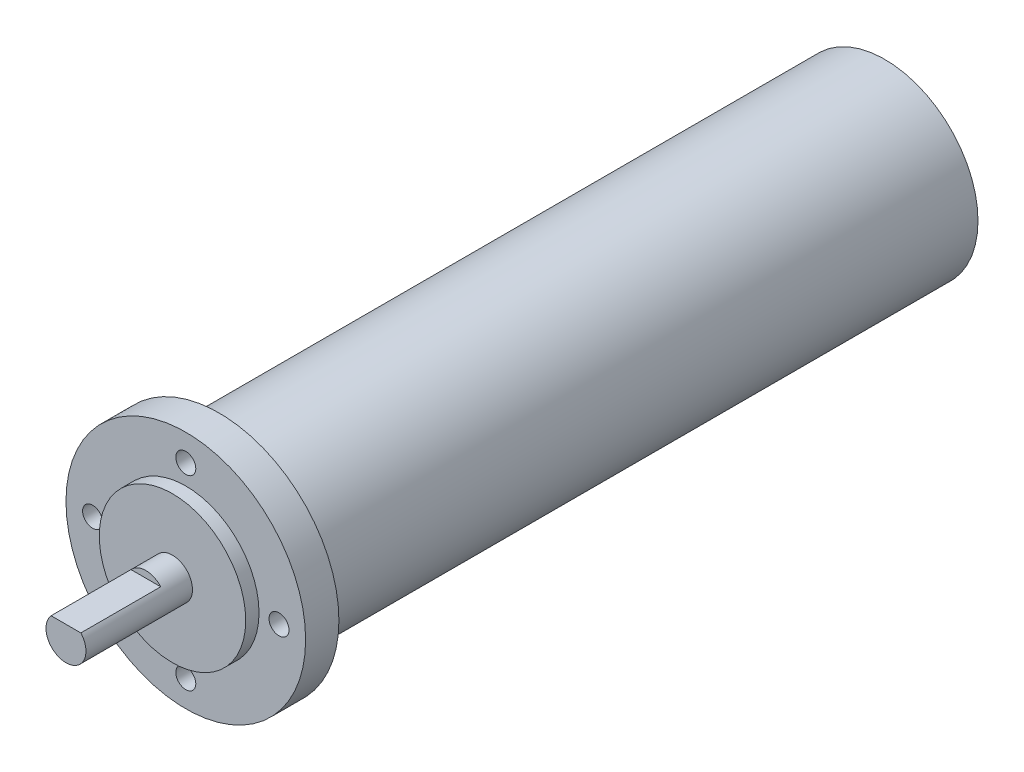
ISO-10303-21;
HEADER;
FILE_DESCRIPTION(('STEP AP214'),'2;1');
FILE_NAME('part.step','',(''),(''),'','','');
FILE_SCHEMA(('AUTOMOTIVE_DESIGN { 1 0 10303 214 1 1 1 1 }'));
ENDSEC;
DATA;
#1=APPLICATION_CONTEXT('core data for automotive mechanical design processes');
#2=APPLICATION_PROTOCOL_DEFINITION('international standard','automotive_design',2000,#1);
#3=PRODUCT_CONTEXT('',#1,'mechanical');
#4=PRODUCT('Part','Part','',(#3));
#5=PRODUCT_RELATED_PRODUCT_CATEGORY('part','',(#4));
#6=PRODUCT_DEFINITION_FORMATION('','',#4);
#7=PRODUCT_DEFINITION_CONTEXT('part definition',#1,'design');
#8=PRODUCT_DEFINITION('design','',#6,#7);
#9=PRODUCT_DEFINITION_SHAPE('','',#8);
#10=(LENGTH_UNIT() NAMED_UNIT(*) SI_UNIT(.MILLI.,.METRE.));
#11=(NAMED_UNIT(*) PLANE_ANGLE_UNIT() SI_UNIT($,.RADIAN.));
#12=(NAMED_UNIT(*) SI_UNIT($,.STERADIAN.) SOLID_ANGLE_UNIT());
#13=UNCERTAINTY_MEASURE_WITH_UNIT(LENGTH_MEASURE(1.E-05),#10,'distance_accuracy_value','');
#14=(GEOMETRIC_REPRESENTATION_CONTEXT(3) GLOBAL_UNCERTAINTY_ASSIGNED_CONTEXT((#13)) GLOBAL_UNIT_ASSIGNED_CONTEXT((#10,
#11,#12)) REPRESENTATION_CONTEXT('',''));
#15=CARTESIAN_POINT('',(0.,0.,0.));
#16=DIRECTION('',(0.,0.,1.));
#17=DIRECTION('',(1.,0.,0.));
#18=AXIS2_PLACEMENT_3D('',#15,#16,#17);
#19=CARTESIAN_POINT('',(0.,0.,107.));
#20=DIRECTION('',(0.,0.,1.));
#21=DIRECTION('',(1.,0.,0.));
#22=AXIS2_PLACEMENT_3D('',#19,#20,#21);
#23=PLANE('',#22);
#24=CARTESIAN_POINT('',(0.,0.,107.));
#25=DIRECTION('',(0.,0.,1.));
#26=DIRECTION('',(1.,0.,0.));
#27=AXIS2_PLACEMENT_3D('',#24,#25,#26);
#28=CIRCLE('',#27,11.);
#29=CARTESIAN_POINT('',(11.,0.,107.));
#30=VERTEX_POINT('',#29);
#31=EDGE_CURVE('E78',#30,#30,#28,.T.);
#32=ORIENTED_EDGE('',*,*,#31,.T.);
#33=EDGE_LOOP('',(#32));
#34=FACE_BOUND('',#33,.T.);
#35=CARTESIAN_POINT('',(0.,0.,107.));
#36=DIRECTION('',(0.,0.,1.));
#37=DIRECTION('',(1.,0.,0.));
#38=AXIS2_PLACEMENT_3D('',#35,#36,#37);
#39=CIRCLE('',#38,3.);
#40=CARTESIAN_POINT('',(3.,0.,107.));
#41=VERTEX_POINT('',#40);
#42=EDGE_CURVE('E70',#41,#41,#39,.T.);
#43=ORIENTED_EDGE('',*,*,#42,.F.);
#44=EDGE_LOOP('',(#43));
#45=FACE_BOUND('',#44,.T.);
#46=ADVANCED_FACE('F33',(#34,#45),#23,.T.);
#47=CARTESIAN_POINT('',(0.,0.,105.));
#48=DIRECTION('',(0.,0.,1.));
#49=DIRECTION('',(1.,0.,0.));
#50=AXIS2_PLACEMENT_3D('',#47,#48,#49);
#51=PLANE('',#50);
#52=CARTESIAN_POINT('',(0.,0.,105.));
#53=DIRECTION('',(0.,0.,1.));
#54=DIRECTION('',(1.,0.,0.));
#55=AXIS2_PLACEMENT_3D('',#52,#53,#54);
#56=CIRCLE('',#55,18.);
#57=CARTESIAN_POINT('',(18.,0.,105.));
#58=VERTEX_POINT('',#57);
#59=EDGE_CURVE('E108',#58,#58,#56,.T.);
#60=ORIENTED_EDGE('',*,*,#59,.T.);
#61=EDGE_LOOP('',(#60));
#62=FACE_BOUND('',#61,.T.);
#63=CARTESIAN_POINT('',(0.,14.,105.));
#64=DIRECTION('',(0.,0.,1.));
#65=DIRECTION('',(1.,0.,0.));
#66=AXIS2_PLACEMENT_3D('',#63,#64,#65);
#67=CIRCLE('',#66,1.5);
#68=CARTESIAN_POINT('',(1.5,14.,105.));
#69=VERTEX_POINT('',#68);
#70=EDGE_CURVE('E99',#69,#69,#67,.T.);
#71=ORIENTED_EDGE('',*,*,#70,.F.);
#72=EDGE_LOOP('',(#71));
#73=FACE_BOUND('',#72,.T.);
#74=CARTESIAN_POINT('',(14.,0.,105.));
#75=DIRECTION('',(0.,0.,1.));
#76=DIRECTION('',(1.,0.,0.));
#77=AXIS2_PLACEMENT_3D('',#74,#75,#76);
#78=CIRCLE('',#77,1.5);
#79=CARTESIAN_POINT('',(15.5,0.,105.));
#80=VERTEX_POINT('',#79);
#81=EDGE_CURVE('E93',#80,#80,#78,.T.);
#82=ORIENTED_EDGE('',*,*,#81,.F.);
#83=EDGE_LOOP('',(#82));
#84=FACE_BOUND('',#83,.T.);
#85=CARTESIAN_POINT('',(0.,-14.,105.));
#86=DIRECTION('',(0.,0.,1.));
#87=DIRECTION('',(1.,0.,0.));
#88=AXIS2_PLACEMENT_3D('',#85,#86,#87);
#89=CIRCLE('',#88,1.5);
#90=CARTESIAN_POINT('',(1.5,-14.,105.));
#91=VERTEX_POINT('',#90);
#92=EDGE_CURVE('E87',#91,#91,#89,.T.);
#93=ORIENTED_EDGE('',*,*,#92,.F.);
#94=EDGE_LOOP('',(#93));
#95=FACE_BOUND('',#94,.T.);
#96=CARTESIAN_POINT('',(-14.,0.,105.));
#97=DIRECTION('',(0.,0.,1.));
#98=DIRECTION('',(1.,0.,0.));
#99=AXIS2_PLACEMENT_3D('',#96,#97,#98);
#100=CIRCLE('',#99,1.5);
#101=CARTESIAN_POINT('',(-12.5,0.,105.));
#102=VERTEX_POINT('',#101);
#103=EDGE_CURVE('E81',#102,#102,#100,.T.);
#104=ORIENTED_EDGE('',*,*,#103,.F.);
#105=EDGE_LOOP('',(#104));
#106=FACE_BOUND('',#105,.T.);
#107=CARTESIAN_POINT('',(0.,0.,105.));
#108=DIRECTION('',(0.,0.,1.));
#109=DIRECTION('',(1.,0.,0.));
#110=AXIS2_PLACEMENT_3D('',#107,#108,#109);
#111=CIRCLE('',#110,11.);
#112=CARTESIAN_POINT('',(11.,0.,105.));
#113=VERTEX_POINT('',#112);
#114=EDGE_CURVE('E76',#113,#113,#111,.T.);
#115=ORIENTED_EDGE('',*,*,#114,.F.);
#116=EDGE_LOOP('',(#115));
#117=FACE_BOUND('',#116,.T.);
#118=ADVANCED_FACE('F131',(#62,#73,#84,#95,#106,#117),#51,.T.);
#119=CARTESIAN_POINT('',(0.,0.,100.));
#120=DIRECTION('',(0.,0.,-1.));
#121=DIRECTION('',(-1.,0.,0.));
#122=AXIS2_PLACEMENT_3D('',#119,#120,#121);
#123=CYLINDRICAL_SURFACE('',#122,14.);
#124=CARTESIAN_POINT('',(0.,0.,100.));
#125=DIRECTION('',(0.,0.,1.));
#126=DIRECTION('',(1.,0.,0.));
#127=AXIS2_PLACEMENT_3D('',#124,#125,#126);
#128=CIRCLE('',#127,14.);
#129=CARTESIAN_POINT('',(14.,0.,100.));
#130=VERTEX_POINT('',#129);
#131=EDGE_CURVE('E114',#130,#130,#128,.T.);
#132=ORIENTED_EDGE('',*,*,#131,.F.);
#133=EDGE_LOOP('',(#132));
#134=FACE_BOUND('',#133,.T.);
#135=CARTESIAN_POINT('',(0.,0.,0.));
#136=DIRECTION('',(0.,0.,1.));
#137=DIRECTION('',(1.,0.,0.));
#138=AXIS2_PLACEMENT_3D('',#135,#136,#137);
#139=CIRCLE('',#138,14.);
#140=CARTESIAN_POINT('',(14.,0.,0.));
#141=VERTEX_POINT('',#140);
#142=EDGE_CURVE('E111',#141,#141,#139,.T.);
#143=ORIENTED_EDGE('',*,*,#142,.T.);
#144=EDGE_LOOP('',(#143));
#145=FACE_BOUND('',#144,.T.);
#146=ADVANCED_FACE('F35',(#134,#145),#123,.T.);
#147=CARTESIAN_POINT('',(0.,0.,0.));
#148=DIRECTION('',(0.,0.,1.));
#149=DIRECTION('',(1.,0.,0.));
#150=AXIS2_PLACEMENT_3D('',#147,#148,#149);
#151=PLANE('',#150);
#152=ORIENTED_EDGE('',*,*,#142,.F.);
#153=EDGE_LOOP('',(#152));
#154=FACE_BOUND('',#153,.T.);
#155=ADVANCED_FACE('F121',(#154),#151,.F.);
#156=CARTESIAN_POINT('',(0.,0.,100.));
#157=DIRECTION('',(0.,0.,1.));
#158=DIRECTION('',(1.,0.,0.));
#159=AXIS2_PLACEMENT_3D('',#156,#157,#158);
#160=PLANE('',#159);
#161=CARTESIAN_POINT('',(0.,0.,100.));
#162=DIRECTION('',(0.,0.,1.));
#163=DIRECTION('',(1.,0.,0.));
#164=AXIS2_PLACEMENT_3D('',#161,#162,#163);
#165=CIRCLE('',#164,18.);
#166=CARTESIAN_POINT('',(18.,0.,100.));
#167=VERTEX_POINT('',#166);
#168=EDGE_CURVE('E105',#167,#167,#165,.T.);
#169=ORIENTED_EDGE('',*,*,#168,.F.);
#170=EDGE_LOOP('',(#169));
#171=FACE_BOUND('',#170,.T.);
#172=ORIENTED_EDGE('',*,*,#131,.T.);
#173=EDGE_LOOP('',(#172));
#174=FACE_BOUND('',#173,.T.);
#175=ADVANCED_FACE('F123',(#171,#174),#160,.F.);
#176=CARTESIAN_POINT('',(0.,0.,105.));
#177=DIRECTION('',(0.,0.,-1.));
#178=DIRECTION('',(-1.,0.,0.));
#179=AXIS2_PLACEMENT_3D('',#176,#177,#178);
#180=CYLINDRICAL_SURFACE('',#179,18.);
#181=ORIENTED_EDGE('',*,*,#59,.F.);
#182=EDGE_LOOP('',(#181));
#183=FACE_BOUND('',#182,.T.);
#184=ORIENTED_EDGE('',*,*,#168,.T.);
#185=EDGE_LOOP('',(#184));
#186=FACE_BOUND('',#185,.T.);
#187=ADVANCED_FACE('F128',(#183,#186),#180,.T.);
#188=CARTESIAN_POINT('',(0.,14.,101.));
#189=DIRECTION('',(0.,0.,1.));
#190=DIRECTION('',(1.,0.,0.));
#191=AXIS2_PLACEMENT_3D('',#188,#189,#190);
#192=CYLINDRICAL_SURFACE('',#191,1.5);
#193=CARTESIAN_POINT('',(0.,14.,101.));
#194=DIRECTION('',(0.,0.,1.));
#195=DIRECTION('',(1.,0.,0.));
#196=AXIS2_PLACEMENT_3D('',#193,#194,#195);
#197=CIRCLE('',#196,1.5);
#198=CARTESIAN_POINT('',(1.5,14.,101.));
#199=VERTEX_POINT('',#198);
#200=EDGE_CURVE('E102',#199,#199,#197,.T.);
#201=ORIENTED_EDGE('',*,*,#200,.F.);
#202=EDGE_LOOP('',(#201));
#203=FACE_BOUND('',#202,.T.);
#204=ORIENTED_EDGE('',*,*,#70,.T.);
#205=EDGE_LOOP('',(#204));
#206=FACE_BOUND('',#205,.T.);
#207=ADVANCED_FACE('F177',(#203,#206),#192,.F.);
#208=CARTESIAN_POINT('',(0.,14.,101.));
#209=DIRECTION('',(0.,0.,1.));
#210=DIRECTION('',(1.,0.,0.));
#211=AXIS2_PLACEMENT_3D('',#208,#209,#210);
#212=PLANE('',#211);
#213=ORIENTED_EDGE('',*,*,#200,.T.);
#214=EDGE_LOOP('',(#213));
#215=FACE_BOUND('',#214,.T.);
#216=ADVANCED_FACE('F173',(#215),#212,.T.);
#217=CARTESIAN_POINT('',(14.,0.,101.));
#218=DIRECTION('',(0.,0.,1.));
#219=DIRECTION('',(1.,0.,0.));
#220=AXIS2_PLACEMENT_3D('',#217,#218,#219);
#221=CYLINDRICAL_SURFACE('',#220,1.5);
#222=CARTESIAN_POINT('',(14.,0.,101.));
#223=DIRECTION('',(0.,0.,1.));
#224=DIRECTION('',(1.,0.,0.));
#225=AXIS2_PLACEMENT_3D('',#222,#223,#224);
#226=CIRCLE('',#225,1.5);
#227=CARTESIAN_POINT('',(15.5,0.,101.));
#228=VERTEX_POINT('',#227);
#229=EDGE_CURVE('E96',#228,#228,#226,.T.);
#230=ORIENTED_EDGE('',*,*,#229,.F.);
#231=EDGE_LOOP('',(#230));
#232=FACE_BOUND('',#231,.T.);
#233=ORIENTED_EDGE('',*,*,#81,.T.);
#234=EDGE_LOOP('',(#233));
#235=FACE_BOUND('',#234,.T.);
#236=ADVANCED_FACE('F169',(#232,#235),#221,.F.);
#237=CARTESIAN_POINT('',(14.,0.,101.));
#238=DIRECTION('',(0.,0.,1.));
#239=DIRECTION('',(1.,0.,0.));
#240=AXIS2_PLACEMENT_3D('',#237,#238,#239);
#241=PLANE('',#240);
#242=ORIENTED_EDGE('',*,*,#229,.T.);
#243=EDGE_LOOP('',(#242));
#244=FACE_BOUND('',#243,.T.);
#245=ADVANCED_FACE('F165',(#244),#241,.T.);
#246=CARTESIAN_POINT('',(0.,-14.,101.));
#247=DIRECTION('',(0.,0.,1.));
#248=DIRECTION('',(1.,0.,0.));
#249=AXIS2_PLACEMENT_3D('',#246,#247,#248);
#250=CYLINDRICAL_SURFACE('',#249,1.5);
#251=CARTESIAN_POINT('',(0.,-14.,101.));
#252=DIRECTION('',(0.,0.,1.));
#253=DIRECTION('',(1.,0.,0.));
#254=AXIS2_PLACEMENT_3D('',#251,#252,#253);
#255=CIRCLE('',#254,1.5);
#256=CARTESIAN_POINT('',(1.5,-14.,101.));
#257=VERTEX_POINT('',#256);
#258=EDGE_CURVE('E90',#257,#257,#255,.T.);
#259=ORIENTED_EDGE('',*,*,#258,.F.);
#260=EDGE_LOOP('',(#259));
#261=FACE_BOUND('',#260,.T.);
#262=ORIENTED_EDGE('',*,*,#92,.T.);
#263=EDGE_LOOP('',(#262));
#264=FACE_BOUND('',#263,.T.);
#265=ADVANCED_FACE('F161',(#261,#264),#250,.F.);
#266=CARTESIAN_POINT('',(0.,-14.,101.));
#267=DIRECTION('',(0.,0.,1.));
#268=DIRECTION('',(1.,0.,0.));
#269=AXIS2_PLACEMENT_3D('',#266,#267,#268);
#270=PLANE('',#269);
#271=ORIENTED_EDGE('',*,*,#258,.T.);
#272=EDGE_LOOP('',(#271));
#273=FACE_BOUND('',#272,.T.);
#274=ADVANCED_FACE('F157',(#273),#270,.T.);
#275=CARTESIAN_POINT('',(-14.,0.,101.));
#276=DIRECTION('',(0.,0.,1.));
#277=DIRECTION('',(1.,0.,0.));
#278=AXIS2_PLACEMENT_3D('',#275,#276,#277);
#279=CYLINDRICAL_SURFACE('',#278,1.5);
#280=CARTESIAN_POINT('',(-14.,0.,101.));
#281=DIRECTION('',(0.,0.,1.));
#282=DIRECTION('',(1.,0.,0.));
#283=AXIS2_PLACEMENT_3D('',#280,#281,#282);
#284=CIRCLE('',#283,1.5);
#285=CARTESIAN_POINT('',(-12.5,0.,101.));
#286=VERTEX_POINT('',#285);
#287=EDGE_CURVE('E84',#286,#286,#284,.T.);
#288=ORIENTED_EDGE('',*,*,#287,.F.);
#289=EDGE_LOOP('',(#288));
#290=FACE_BOUND('',#289,.T.);
#291=ORIENTED_EDGE('',*,*,#103,.T.);
#292=EDGE_LOOP('',(#291));
#293=FACE_BOUND('',#292,.T.);
#294=ADVANCED_FACE('F153',(#290,#293),#279,.F.);
#295=CARTESIAN_POINT('',(-14.,0.,101.));
#296=DIRECTION('',(0.,0.,1.));
#297=DIRECTION('',(1.,0.,0.));
#298=AXIS2_PLACEMENT_3D('',#295,#296,#297);
#299=PLANE('',#298);
#300=ORIENTED_EDGE('',*,*,#287,.T.);
#301=EDGE_LOOP('',(#300));
#302=FACE_BOUND('',#301,.T.);
#303=ADVANCED_FACE('F149',(#302),#299,.T.);
#304=CARTESIAN_POINT('',(0.,0.,107.));
#305=DIRECTION('',(0.,0.,-1.));
#306=DIRECTION('',(-1.,0.,0.));
#307=AXIS2_PLACEMENT_3D('',#304,#305,#306);
#308=CYLINDRICAL_SURFACE('',#307,11.);
#309=ORIENTED_EDGE('',*,*,#31,.F.);
#310=EDGE_LOOP('',(#309));
#311=FACE_BOUND('',#310,.T.);
#312=ORIENTED_EDGE('',*,*,#114,.T.);
#313=EDGE_LOOP('',(#312));
#314=FACE_BOUND('',#313,.T.);
#315=ADVANCED_FACE('F146',(#311,#314),#308,.T.);
#316=CARTESIAN_POINT('',(0.,0.,123.));
#317=DIRECTION('',(0.,0.,-1.));
#318=DIRECTION('',(-1.,0.,0.));
#319=AXIS2_PLACEMENT_3D('',#316,#317,#318);
#320=CYLINDRICAL_SURFACE('',#319,3.);
#321=CARTESIAN_POINT('',(0.,0.,123.));
#322=DIRECTION('',(0.,0.,1.));
#323=DIRECTION('',(1.,0.,0.));
#324=AXIS2_PLACEMENT_3D('',#321,#322,#323);
#325=CIRCLE('',#324,3.);
#326=CARTESIAN_POINT('',(-2.23606797749979,2.,123.));
#327=VERTEX_POINT('',#326);
#328=CARTESIAN_POINT('',(2.23606797749979,2.,123.));
#329=VERTEX_POINT('',#328);
#330=EDGE_CURVE('E69',#327,#329,#325,.T.);
#331=ORIENTED_EDGE('',*,*,#330,.F.);
#332=DIRECTION('',(0.,0.,-1.));
#333=VECTOR('',#332,1.);
#334=CARTESIAN_POINT('',(-2.23606797749979,2.,123.));
#335=LINE('',#334,#333);
#336=CARTESIAN_POINT('',(-2.23606797749979,2.,111.));
#337=VERTEX_POINT('',#336);
#338=EDGE_CURVE('E48',#327,#337,#335,.T.);
#339=ORIENTED_EDGE('',*,*,#338,.T.);
#340=CARTESIAN_POINT('',(0.,0.,111.));
#341=DIRECTION('',(0.,0.,-1.));
#342=DIRECTION('',(-1.,0.,0.));
#343=AXIS2_PLACEMENT_3D('',#340,#341,#342);
#344=CIRCLE('',#343,3.);
#345=CARTESIAN_POINT('',(2.23606797749979,2.,111.));
#346=VERTEX_POINT('',#345);
#347=EDGE_CURVE('E11',#337,#346,#344,.T.);
#348=ORIENTED_EDGE('',*,*,#347,.T.);
#349=DIRECTION('',(0.,0.,-1.));
#350=VECTOR('',#349,1.);
#351=CARTESIAN_POINT('',(2.23606797749979,2.,123.));
#352=LINE('',#351,#350);
#353=EDGE_CURVE('E63',#346,#329,#352,.F.);
#354=ORIENTED_EDGE('',*,*,#353,.T.);
#355=EDGE_LOOP('',(#331,#339,#348,#354));
#356=FACE_BOUND('',#355,.T.);
#357=ORIENTED_EDGE('',*,*,#42,.T.);
#358=EDGE_LOOP('',(#357));
#359=FACE_BOUND('',#358,.T.);
#360=ADVANCED_FACE('F66',(#356,#359),#320,.T.);
#361=CARTESIAN_POINT('',(0.,0.,123.));
#362=DIRECTION('',(0.,0.,1.));
#363=DIRECTION('',(1.,0.,0.));
#364=AXIS2_PLACEMENT_3D('',#361,#362,#363);
#365=PLANE('',#364);
#366=DIRECTION('',(1.,0.,0.));
#367=VECTOR('',#366,1.);
#368=CARTESIAN_POINT('',(0.,2.,123.));
#369=LINE('',#368,#367);
#370=EDGE_CURVE('E41',#327,#329,#369,.T.);
#371=ORIENTED_EDGE('',*,*,#370,.F.);
#372=ORIENTED_EDGE('',*,*,#330,.T.);
#373=EDGE_LOOP('',(#371,#372));
#374=FACE_BOUND('',#373,.T.);
#375=ADVANCED_FACE('F250',(#374),#365,.T.);
#376=CARTESIAN_POINT('',(-8.,9.15103911934119,111.));
#377=DIRECTION('',(0.,0.,-1.));
#378=DIRECTION('',(-1.,0.,0.));
#379=AXIS2_PLACEMENT_3D('',#376,#377,#378);
#380=PLANE('',#379);
#381=DIRECTION('',(1.,0.,0.));
#382=VECTOR('',#381,1.);
#383=CARTESIAN_POINT('',(-8.,2.,111.));
#384=LINE('',#383,#382);
#385=EDGE_CURVE('E60',#337,#346,#384,.T.);
#386=ORIENTED_EDGE('',*,*,#385,.T.);
#387=ORIENTED_EDGE('',*,*,#347,.F.);
#388=EDGE_LOOP('',(#386,#387));
#389=FACE_BOUND('',#388,.T.);
#390=ADVANCED_FACE('F59',(#389),#380,.F.);
#391=CARTESIAN_POINT('',(-8.,2.,124.782002666367));
#392=DIRECTION('',(0.,-1.,0.));
#393=DIRECTION('',(0.,0.,-1.));
#394=AXIS2_PLACEMENT_3D('',#391,#392,#393);
#395=PLANE('',#394);
#396=ORIENTED_EDGE('',*,*,#370,.T.);
#397=ORIENTED_EDGE('',*,*,#353,.F.);
#398=ORIENTED_EDGE('',*,*,#385,.F.);
#399=ORIENTED_EDGE('',*,*,#338,.F.);
#400=EDGE_LOOP('',(#396,#397,#398,#399));
#401=FACE_BOUND('',#400,.T.);
#402=ADVANCED_FACE('F62',(#401),#395,.F.);
#403=CLOSED_SHELL('',(#46,#118,#146,#155,#175,#187,#207,#216,#236,#245,#265,#274,#294,#303,#315,
#360,#375,#390,#402));
#404=MANIFOLD_SOLID_BREP('B2',#403);
#405=ADVANCED_BREP_SHAPE_REPRESENTATION('',(#18,#404),#14);
#406=SHAPE_DEFINITION_REPRESENTATION(#9,#405);
ENDSEC;
END-ISO-10303-21;
